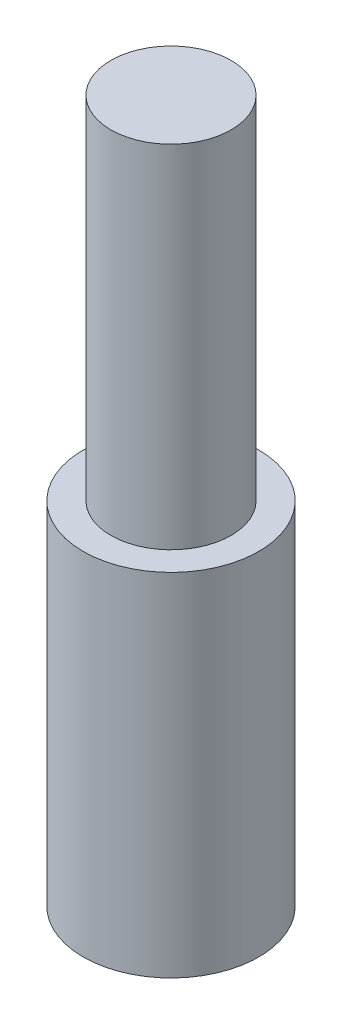
ISO-10303-21;
HEADER;
FILE_DESCRIPTION(('STEP AP214'),'2;1');
FILE_NAME('part.step','',(''),(''),'','','');
FILE_SCHEMA(('AUTOMOTIVE_DESIGN { 1 0 10303 214 1 1 1 1 }'));
ENDSEC;
DATA;
#1=APPLICATION_CONTEXT('core data for automotive mechanical design processes');
#2=APPLICATION_PROTOCOL_DEFINITION('international standard','automotive_design',2000,#1);
#3=PRODUCT_CONTEXT('',#1,'mechanical');
#4=PRODUCT('Part','Part','',(#3));
#5=PRODUCT_RELATED_PRODUCT_CATEGORY('part','',(#4));
#6=PRODUCT_DEFINITION_FORMATION('','',#4);
#7=PRODUCT_DEFINITION_CONTEXT('part definition',#1,'design');
#8=PRODUCT_DEFINITION('design','',#6,#7);
#9=PRODUCT_DEFINITION_SHAPE('','',#8);
#10=(LENGTH_UNIT() NAMED_UNIT(*) SI_UNIT(.MILLI.,.METRE.));
#11=(NAMED_UNIT(*) PLANE_ANGLE_UNIT() SI_UNIT($,.RADIAN.));
#12=(NAMED_UNIT(*) SI_UNIT($,.STERADIAN.) SOLID_ANGLE_UNIT());
#13=UNCERTAINTY_MEASURE_WITH_UNIT(LENGTH_MEASURE(1.E-05),#10,'distance_accuracy_value','');
#14=(GEOMETRIC_REPRESENTATION_CONTEXT(3) GLOBAL_UNCERTAINTY_ASSIGNED_CONTEXT((#13)) GLOBAL_UNIT_ASSIGNED_CONTEXT((#10,
#11,#12)) REPRESENTATION_CONTEXT('',''));
#15=CARTESIAN_POINT('',(0.,0.,0.));
#16=DIRECTION('',(0.,0.,1.));
#17=DIRECTION('',(1.,0.,0.));
#18=AXIS2_PLACEMENT_3D('',#15,#16,#17);
#19=CARTESIAN_POINT('',(0.,38.1,0.));
#20=DIRECTION('',(0.,-1.,0.));
#21=DIRECTION('',(0.,0.,-1.));
#22=AXIS2_PLACEMENT_3D('',#19,#20,#21);
#23=CYLINDRICAL_SURFACE('',#22,4.7625);
#24=CARTESIAN_POINT('',(0.,0.,0.));
#25=DIRECTION('',(0.,1.,0.));
#26=DIRECTION('',(0.,0.,1.));
#27=AXIS2_PLACEMENT_3D('',#24,#25,#26);
#28=CIRCLE('',#27,4.7625);
#29=CARTESIAN_POINT('',(0.,0.,-4.7625));
#30=VERTEX_POINT('',#29);
#31=EDGE_CURVE('E10',#30,#30,#28,.T.);
#32=CARTESIAN_POINT('',(0.,19.05,0.));
#33=DIRECTION('',(0.,1.,0.));
#34=DIRECTION('',(0.,0.,1.));
#35=AXIS2_PLACEMENT_3D('',#32,#33,#34);
#36=CIRCLE('',#35,4.7625);
#37=CARTESIAN_POINT('',(0.,19.05,-4.7625));
#38=VERTEX_POINT('',#37);
#39=EDGE_CURVE('E35',#38,#38,#36,.T.);
#40=CARTESIAN_POINT('',(0.,0.,-4.7625));
#41=CARTESIAN_POINT('',(0.,0.1984375,-4.7625));
#42=CARTESIAN_POINT('',(0.,0.396875,-4.7625));
#43=CARTESIAN_POINT('',(0.,0.793750000000001,-4.7625));
#44=CARTESIAN_POINT('',(0.,0.992187500000001,-4.7625));
#45=CARTESIAN_POINT('',(0.,1.3890625,-4.7625));
#46=CARTESIAN_POINT('',(0.,1.5875,-4.7625));
#47=CARTESIAN_POINT('',(0.,1.984375,-4.7625));
#48=CARTESIAN_POINT('',(0.,2.1828125,-4.7625));
#49=CARTESIAN_POINT('',(0.,2.5796875,-4.7625));
#50=CARTESIAN_POINT('',(0.,2.778125,-4.7625));
#51=CARTESIAN_POINT('',(0.,3.175,-4.7625));
#52=CARTESIAN_POINT('',(0.,3.3734375,-4.7625));
#53=CARTESIAN_POINT('',(0.,3.7703125,-4.7625));
#54=CARTESIAN_POINT('',(0.,3.96875,-4.7625));
#55=CARTESIAN_POINT('',(0.,4.365625,-4.7625));
#56=CARTESIAN_POINT('',(0.,4.5640625,-4.7625));
#57=CARTESIAN_POINT('',(0.,4.9609375,-4.7625));
#58=CARTESIAN_POINT('',(0.,5.159375,-4.7625));
#59=CARTESIAN_POINT('',(0.,5.55625,-4.7625));
#60=CARTESIAN_POINT('',(0.,5.7546875,-4.7625));
#61=CARTESIAN_POINT('',(0.,6.1515625,-4.7625));
#62=CARTESIAN_POINT('',(0.,6.35,-4.7625));
#63=CARTESIAN_POINT('',(0.,6.746875,-4.7625));
#64=CARTESIAN_POINT('',(0.,6.9453125,-4.7625));
#65=CARTESIAN_POINT('',(0.,7.3421875,-4.7625));
#66=CARTESIAN_POINT('',(0.,7.540625,-4.7625));
#67=CARTESIAN_POINT('',(0.,7.9375,-4.7625));
#68=CARTESIAN_POINT('',(0.,8.1359375,-4.7625));
#69=CARTESIAN_POINT('',(0.,8.5328125,-4.7625));
#70=CARTESIAN_POINT('',(0.,8.73125,-4.7625));
#71=CARTESIAN_POINT('',(0.,9.128125,-4.7625));
#72=CARTESIAN_POINT('',(0.,9.3265625,-4.7625));
#73=CARTESIAN_POINT('',(0.,9.7234375,-4.7625));
#74=CARTESIAN_POINT('',(0.,9.921875,-4.7625));
#75=CARTESIAN_POINT('',(0.,10.31875,-4.7625));
#76=CARTESIAN_POINT('',(0.,10.5171875,-4.7625));
#77=CARTESIAN_POINT('',(0.,10.9140625,-4.7625));
#78=CARTESIAN_POINT('',(0.,11.1125,-4.7625));
#79=CARTESIAN_POINT('',(0.,11.509375,-4.7625));
#80=CARTESIAN_POINT('',(0.,11.7078125,-4.7625));
#81=CARTESIAN_POINT('',(0.,12.1046875,-4.7625));
#82=CARTESIAN_POINT('',(0.,12.303125,-4.7625));
#83=CARTESIAN_POINT('',(0.,12.7,-4.7625));
#84=CARTESIAN_POINT('',(0.,12.8984375,-4.7625));
#85=CARTESIAN_POINT('',(0.,13.2953125,-4.7625));
#86=CARTESIAN_POINT('',(0.,13.49375,-4.7625));
#87=CARTESIAN_POINT('',(0.,13.890625,-4.7625));
#88=CARTESIAN_POINT('',(0.,14.0890625,-4.7625));
#89=CARTESIAN_POINT('',(0.,14.4859375,-4.7625));
#90=CARTESIAN_POINT('',(0.,14.684375,-4.7625));
#91=CARTESIAN_POINT('',(0.,15.08125,-4.7625));
#92=CARTESIAN_POINT('',(0.,15.2796875,-4.7625));
#93=CARTESIAN_POINT('',(0.,15.6765625,-4.7625));
#94=CARTESIAN_POINT('',(0.,15.875,-4.7625));
#95=CARTESIAN_POINT('',(0.,16.271875,-4.7625));
#96=CARTESIAN_POINT('',(0.,16.4703125,-4.7625));
#97=CARTESIAN_POINT('',(0.,16.8671875,-4.7625));
#98=CARTESIAN_POINT('',(0.,17.065625,-4.7625));
#99=CARTESIAN_POINT('',(0.,17.4625,-4.7625));
#100=CARTESIAN_POINT('',(0.,17.6609375,-4.7625));
#101=CARTESIAN_POINT('',(0.,18.0578125,-4.7625));
#102=CARTESIAN_POINT('',(0.,18.25625,-4.7625));
#103=CARTESIAN_POINT('',(0.,18.653125,-4.7625));
#104=CARTESIAN_POINT('',(0.,18.8515625,-4.7625));
#105=CARTESIAN_POINT('',(0.,19.05,-4.7625));
#106=B_SPLINE_CURVE_WITH_KNOTS('',3,(#40,#41,#42,#43,#44,#45,#46,#47,#48,#49,#50,#51,#52,#53,
#54,#55,#56,#57,#58,#59,#60,#61,#62,#63,#64,#65,#66,#67,#68,#69,#70,#71,#72,#73,#74,#75,#76,#77,
#78,#79,#80,#81,#82,#83,#84,#85,#86,#87,#88,#89,#90,#91,#92,#93,#94,#95,#96,#97,#98,#99,#100,
#101,#102,#103,#104,#105),.UNSPECIFIED.,.F.,.F.,(4,2,2,2,2,2,2,2,2,2,2,2,2,2,2,2,2,2,2,2,2,2,2,
2,2,2,2,2,2,2,2,2,4),(0.,0.5953125,1.190625,1.7859375,2.38125,2.9765625,3.571875,4.1671875,
4.7625,5.3578125,5.953125,6.5484375,7.14375,7.7390625,8.334375,8.9296875,9.525,10.1203125,
10.715625,11.3109375,11.90625,12.5015625,13.096875,13.6921875,14.2875,14.8828125,15.478125,
16.0734375,16.66875,17.2640625,17.859375,18.4546875,19.05),.UNSPECIFIED.);
#107=EDGE_CURVE('BSEAM32',#30,#38,#106,.T.);
#108=ORIENTED_EDGE('',*,*,#31,.T.);
#109=ORIENTED_EDGE('',*,*,#39,.F.);
#110=ORIENTED_EDGE('',*,*,#107,.T.);
#111=ORIENTED_EDGE('',*,*,#107,.F.);
#112=EDGE_LOOP('',(#108,#110,#109,#111));
#113=FACE_BOUND('',#112,.T.);
#114=ADVANCED_FACE('F32',(#113),#23,.T.);
#115=CARTESIAN_POINT('',(0.,0.,0.));
#116=DIRECTION('',(0.,1.,0.));
#117=DIRECTION('',(0.,0.,1.));
#118=AXIS2_PLACEMENT_3D('',#115,#116,#117);
#119=PLANE('',#118);
#120=ORIENTED_EDGE('',*,*,#31,.F.);
#121=EDGE_LOOP('',(#120));
#122=FACE_BOUND('',#121,.T.);
#123=ADVANCED_FACE('F56',(#122),#119,.F.);
#124=CARTESIAN_POINT('',(0.,19.05,0.));
#125=DIRECTION('',(0.,1.,0.));
#126=DIRECTION('',(0.,0.,1.));
#127=AXIS2_PLACEMENT_3D('',#124,#125,#126);
#128=PLANE('',#127);
#129=CARTESIAN_POINT('',(0.,19.05,0.));
#130=DIRECTION('',(0.,1.,0.));
#131=DIRECTION('',(0.,0.,1.));
#132=AXIS2_PLACEMENT_3D('',#129,#130,#131);
#133=CIRCLE('',#132,3.2625);
#134=CARTESIAN_POINT('',(0.,19.05,3.2625));
#135=VERTEX_POINT('',#134);
#136=EDGE_CURVE('E42',#135,#135,#133,.T.);
#137=ORIENTED_EDGE('',*,*,#136,.F.);
#138=EDGE_LOOP('',(#137));
#139=FACE_BOUND('',#138,.T.);
#140=ORIENTED_EDGE('',*,*,#39,.T.);
#141=EDGE_LOOP('',(#140));
#142=FACE_BOUND('',#141,.T.);
#143=ADVANCED_FACE('F53',(#139,#142),#128,.T.);
#144=CARTESIAN_POINT('',(0.,19.05,0.));
#145=DIRECTION('',(0.,1.,0.));
#146=DIRECTION('',(0.,0.,1.));
#147=AXIS2_PLACEMENT_3D('',#144,#145,#146);
#148=CYLINDRICAL_SURFACE('',#147,3.2625);
#149=CARTESIAN_POINT('',(0.,38.1,0.));
#150=DIRECTION('',(0.,1.,0.));
#151=DIRECTION('',(0.,0.,1.));
#152=AXIS2_PLACEMENT_3D('',#149,#150,#151);
#153=CIRCLE('',#152,3.2625);
#154=CARTESIAN_POINT('',(0.,38.1,3.2625));
#155=VERTEX_POINT('',#154);
#156=EDGE_CURVE('E44',#155,#155,#153,.T.);
#157=CARTESIAN_POINT('',(0.,19.05,3.2625));
#158=CARTESIAN_POINT('',(0.,19.2484375,3.2625));
#159=CARTESIAN_POINT('',(0.,19.446875,3.2625));
#160=CARTESIAN_POINT('',(0.,19.84375,3.2625));
#161=CARTESIAN_POINT('',(0.,20.0421875,3.2625));
#162=CARTESIAN_POINT('',(0.,20.4390625,3.2625));
#163=CARTESIAN_POINT('',(0.,20.6375,3.2625));
#164=CARTESIAN_POINT('',(0.,21.034375,3.2625));
#165=CARTESIAN_POINT('',(0.,21.2328125,3.2625));
#166=CARTESIAN_POINT('',(0.,21.6296875,3.2625));
#167=CARTESIAN_POINT('',(0.,21.828125,3.2625));
#168=CARTESIAN_POINT('',(0.,22.225,3.2625));
#169=CARTESIAN_POINT('',(0.,22.4234375,3.2625));
#170=CARTESIAN_POINT('',(0.,22.8203125,3.2625));
#171=CARTESIAN_POINT('',(0.,23.01875,3.2625));
#172=CARTESIAN_POINT('',(0.,23.415625,3.2625));
#173=CARTESIAN_POINT('',(0.,23.6140625,3.2625));
#174=CARTESIAN_POINT('',(0.,24.0109375,3.2625));
#175=CARTESIAN_POINT('',(0.,24.209375,3.2625));
#176=CARTESIAN_POINT('',(0.,24.60625,3.2625));
#177=CARTESIAN_POINT('',(0.,24.8046875,3.2625));
#178=CARTESIAN_POINT('',(0.,25.2015625,3.2625));
#179=CARTESIAN_POINT('',(0.,25.4,3.2625));
#180=CARTESIAN_POINT('',(0.,25.796875,3.2625));
#181=CARTESIAN_POINT('',(0.,25.9953125,3.2625));
#182=CARTESIAN_POINT('',(0.,26.3921875,3.2625));
#183=CARTESIAN_POINT('',(0.,26.590625,3.2625));
#184=CARTESIAN_POINT('',(0.,26.9875,3.2625));
#185=CARTESIAN_POINT('',(0.,27.1859375,3.2625));
#186=CARTESIAN_POINT('',(0.,27.5828125,3.2625));
#187=CARTESIAN_POINT('',(0.,27.78125,3.2625));
#188=CARTESIAN_POINT('',(0.,28.178125,3.2625));
#189=CARTESIAN_POINT('',(0.,28.3765625,3.2625));
#190=CARTESIAN_POINT('',(0.,28.7734375,3.2625));
#191=CARTESIAN_POINT('',(0.,28.971875,3.2625));
#192=CARTESIAN_POINT('',(0.,29.36875,3.2625));
#193=CARTESIAN_POINT('',(0.,29.5671875,3.2625));
#194=CARTESIAN_POINT('',(0.,29.9640625,3.2625));
#195=CARTESIAN_POINT('',(0.,30.1625,3.2625));
#196=CARTESIAN_POINT('',(0.,30.559375,3.2625));
#197=CARTESIAN_POINT('',(0.,30.7578125,3.2625));
#198=CARTESIAN_POINT('',(0.,31.1546875,3.2625));
#199=CARTESIAN_POINT('',(0.,31.353125,3.2625));
#200=CARTESIAN_POINT('',(0.,31.75,3.2625));
#201=CARTESIAN_POINT('',(0.,31.9484375,3.2625));
#202=CARTESIAN_POINT('',(0.,32.3453125,3.2625));
#203=CARTESIAN_POINT('',(0.,32.54375,3.2625));
#204=CARTESIAN_POINT('',(0.,32.940625,3.2625));
#205=CARTESIAN_POINT('',(0.,33.1390625,3.2625));
#206=CARTESIAN_POINT('',(0.,33.5359375,3.2625));
#207=CARTESIAN_POINT('',(0.,33.734375,3.2625));
#208=CARTESIAN_POINT('',(0.,34.13125,3.2625));
#209=CARTESIAN_POINT('',(0.,34.3296875,3.2625));
#210=CARTESIAN_POINT('',(0.,34.7265625,3.2625));
#211=CARTESIAN_POINT('',(0.,34.925,3.2625));
#212=CARTESIAN_POINT('',(0.,35.321875,3.2625));
#213=CARTESIAN_POINT('',(0.,35.5203125,3.2625));
#214=CARTESIAN_POINT('',(0.,35.9171875,3.2625));
#215=CARTESIAN_POINT('',(0.,36.115625,3.2625));
#216=CARTESIAN_POINT('',(0.,36.5125,3.2625));
#217=CARTESIAN_POINT('',(0.,36.7109375,3.2625));
#218=CARTESIAN_POINT('',(0.,37.1078125,3.2625));
#219=CARTESIAN_POINT('',(0.,37.30625,3.2625));
#220=CARTESIAN_POINT('',(0.,37.703125,3.2625));
#221=CARTESIAN_POINT('',(0.,37.9015625,3.2625));
#222=CARTESIAN_POINT('',(0.,38.1,3.2625));
#223=B_SPLINE_CURVE_WITH_KNOTS('',3,(#157,#158,#159,#160,#161,#162,#163,#164,#165,#166,#167,
#168,#169,#170,#171,#172,#173,#174,#175,#176,#177,#178,#179,#180,#181,#182,#183,#184,#185,#186,
#187,#188,#189,#190,#191,#192,#193,#194,#195,#196,#197,#198,#199,#200,#201,#202,#203,#204,#205,
#206,#207,#208,#209,#210,#211,#212,#213,#214,#215,#216,#217,#218,#219,#220,#221,#222),
.UNSPECIFIED.,.F.,.F.,(4,2,2,2,2,2,2,2,2,2,2,2,2,2,2,2,2,2,2,2,2,2,2,2,2,2,2,2,2,2,2,2,4),(0.,
0.595312499999997,1.190625,1.7859375,2.38125,2.9765625,3.571875,4.1671875,4.7625,5.3578125,
5.953125,6.5484375,7.14375,7.7390625,8.334375,8.9296875,9.525,10.1203125,10.715625,11.3109375,
11.90625,12.5015625,13.096875,13.6921875,14.2875,14.8828125,15.478125,16.0734375,16.66875,
17.2640625,17.859375,18.4546875,19.05),.UNSPECIFIED.);
#224=EDGE_CURVE('BSEAM50',#135,#155,#223,.T.);
#225=ORIENTED_EDGE('',*,*,#136,.T.);
#226=ORIENTED_EDGE('',*,*,#156,.F.);
#227=ORIENTED_EDGE('',*,*,#224,.T.);
#228=ORIENTED_EDGE('',*,*,#224,.F.);
#229=EDGE_LOOP('',(#225,#227,#226,#228));
#230=FACE_BOUND('',#229,.T.);
#231=ADVANCED_FACE('F50',(#230),#148,.T.);
#232=CARTESIAN_POINT('',(0.,38.1,0.));
#233=DIRECTION('',(0.,1.,0.));
#234=DIRECTION('',(0.,0.,1.));
#235=AXIS2_PLACEMENT_3D('',#232,#233,#234);
#236=PLANE('',#235);
#237=ORIENTED_EDGE('',*,*,#156,.T.);
#238=EDGE_LOOP('',(#237));
#239=FACE_BOUND('',#238,.T.);
#240=ADVANCED_FACE('F68',(#239),#236,.T.);
#241=CLOSED_SHELL('',(#114,#123,#143,#231,#240));
#242=MANIFOLD_SOLID_BREP('B2',#241);
#243=ADVANCED_BREP_SHAPE_REPRESENTATION('',(#18,#242),#14);
#244=SHAPE_DEFINITION_REPRESENTATION(#9,#243);
ENDSEC;
END-ISO-10303-21;
